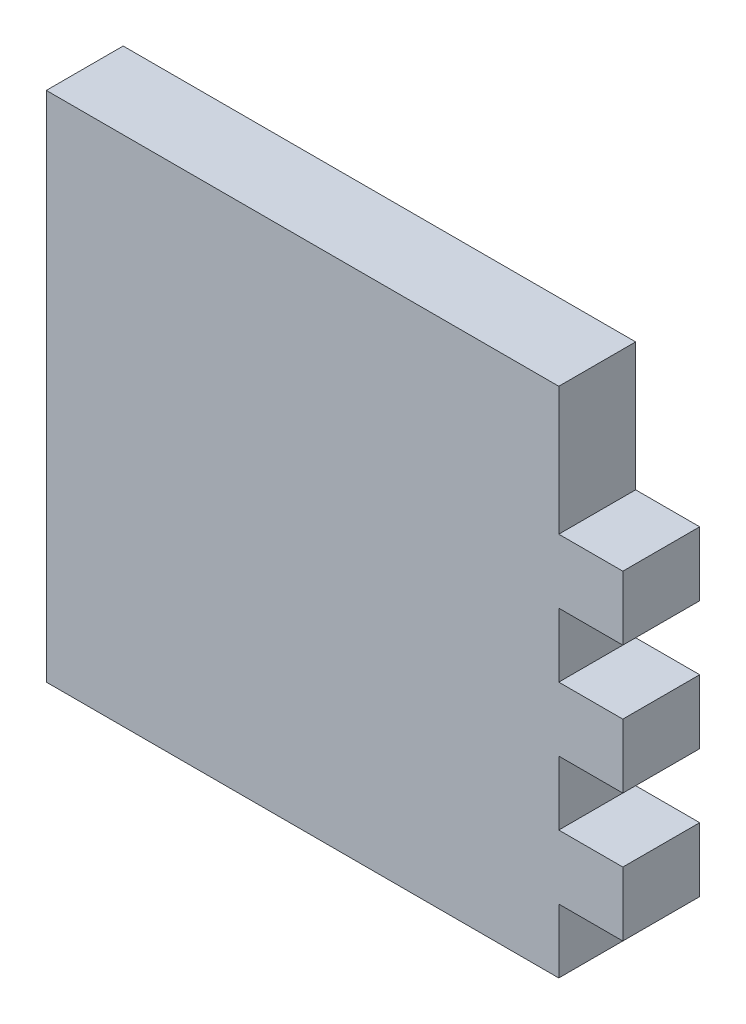
ISO-10303-21;
HEADER;
FILE_DESCRIPTION(('STEP AP214'),'2;1');
FILE_NAME('part.step','',(''),(''),'','','');
FILE_SCHEMA(('AUTOMOTIVE_DESIGN { 1 0 10303 214 1 1 1 1 }'));
ENDSEC;
DATA;
#1=APPLICATION_CONTEXT('core data for automotive mechanical design processes');
#2=APPLICATION_PROTOCOL_DEFINITION('international standard','automotive_design',2000,#1);
#3=PRODUCT_CONTEXT('',#1,'mechanical');
#4=PRODUCT('Part','Part','',(#3));
#5=PRODUCT_RELATED_PRODUCT_CATEGORY('part','',(#4));
#6=PRODUCT_DEFINITION_FORMATION('','',#4);
#7=PRODUCT_DEFINITION_CONTEXT('part definition',#1,'design');
#8=PRODUCT_DEFINITION('design','',#6,#7);
#9=PRODUCT_DEFINITION_SHAPE('','',#8);
#10=(LENGTH_UNIT() NAMED_UNIT(*) SI_UNIT(.MILLI.,.METRE.));
#11=(NAMED_UNIT(*) PLANE_ANGLE_UNIT() SI_UNIT($,.RADIAN.));
#12=(NAMED_UNIT(*) SI_UNIT($,.STERADIAN.) SOLID_ANGLE_UNIT());
#13=UNCERTAINTY_MEASURE_WITH_UNIT(LENGTH_MEASURE(1.E-05),#10,'distance_accuracy_value','');
#14=(GEOMETRIC_REPRESENTATION_CONTEXT(3) GLOBAL_UNCERTAINTY_ASSIGNED_CONTEXT((#13)) GLOBAL_UNIT_ASSIGNED_CONTEXT((#10,
#11,#12)) REPRESENTATION_CONTEXT('',''));
#15=CARTESIAN_POINT('',(0.,0.,0.));
#16=DIRECTION('',(0.,0.,1.));
#17=DIRECTION('',(1.,0.,0.));
#18=AXIS2_PLACEMENT_3D('',#15,#16,#17);
#19=CARTESIAN_POINT('',(27.3134328358209,0.,6.));
#20=DIRECTION('',(1.,0.,0.));
#21=DIRECTION('',(0.,0.,-1.));
#22=AXIS2_PLACEMENT_3D('',#19,#20,#21);
#23=PLANE('',#22);
#24=DIRECTION('',(0.,-1.,0.));
#25=VECTOR('',#24,1.);
#26=CARTESIAN_POINT('',(27.3134328358209,0.,0.));
#27=LINE('',#26,#25);
#28=CARTESIAN_POINT('',(27.3134328358209,-20.5970149253731,0.));
#29=VERTEX_POINT('',#28);
#30=CARTESIAN_POINT('',(27.3134328358209,-25.5970149253731,0.));
#31=VERTEX_POINT('',#30);
#32=EDGE_CURVE('E257',#29,#31,#27,.T.);
#33=ORIENTED_EDGE('',*,*,#32,.F.);
#34=DIRECTION('',(0.,0.,-1.));
#35=VECTOR('',#34,1.);
#36=CARTESIAN_POINT('',(27.3134328358209,-20.5970149253731,6.));
#37=LINE('',#36,#35);
#38=CARTESIAN_POINT('',(27.3134328358209,-20.5970149253731,6.));
#39=VERTEX_POINT('',#38);
#40=EDGE_CURVE('E354',#39,#29,#37,.T.);
#41=ORIENTED_EDGE('',*,*,#40,.F.);
#42=DIRECTION('',(0.,-1.,0.));
#43=VECTOR('',#42,1.);
#44=CARTESIAN_POINT('',(27.3134328358209,0.,6.));
#45=LINE('',#44,#43);
#46=CARTESIAN_POINT('',(27.3134328358209,-25.5970149253731,6.));
#47=VERTEX_POINT('',#46);
#48=EDGE_CURVE('E172',#39,#47,#45,.T.);
#49=ORIENTED_EDGE('',*,*,#48,.T.);
#50=DIRECTION('',(0.,0.,-1.));
#51=VECTOR('',#50,1.);
#52=CARTESIAN_POINT('',(27.3134328358209,-25.5970149253731,6.));
#53=LINE('',#52,#51);
#54=EDGE_CURVE('E273',#47,#31,#53,.T.);
#55=ORIENTED_EDGE('',*,*,#54,.T.);
#56=EDGE_LOOP('',(#33,#41,#49,#55));
#57=FACE_BOUND('',#56,.T.);
#58=ADVANCED_FACE('F41',(#57),#23,.T.);
#59=DIRECTION('',(0.,0.,-1.));
#60=VECTOR('',#59,1.);
#61=CARTESIAN_POINT('',(27.3134328358209,-15.5970149253731,6.));
#62=LINE('',#61,#60);
#63=CARTESIAN_POINT('',(27.3134328358209,-15.5970149253731,6.));
#64=VERTEX_POINT('',#63);
#65=CARTESIAN_POINT('',(27.3134328358209,-15.5970149253731,0.));
#66=VERTEX_POINT('',#65);
#67=EDGE_CURVE('E185',#64,#66,#62,.T.);
#68=ORIENTED_EDGE('',*,*,#67,.T.);
#69=CARTESIAN_POINT('',(27.3134328358209,-10.5970149253731,0.));
#70=VERTEX_POINT('',#69);
#71=EDGE_CURVE('E329',#70,#66,#27,.T.);
#72=ORIENTED_EDGE('',*,*,#71,.F.);
#73=DIRECTION('',(0.,0.,-1.));
#74=VECTOR('',#73,1.);
#75=CARTESIAN_POINT('',(27.3134328358209,-10.5970149253731,6.));
#76=LINE('',#75,#74);
#77=CARTESIAN_POINT('',(27.3134328358209,-10.5970149253731,6.));
#78=VERTEX_POINT('',#77);
#79=EDGE_CURVE('E200',#78,#70,#76,.T.);
#80=ORIENTED_EDGE('',*,*,#79,.F.);
#81=EDGE_CURVE('E342',#78,#64,#45,.T.);
#82=ORIENTED_EDGE('',*,*,#81,.T.);
#83=EDGE_LOOP('',(#68,#72,#80,#82));
#84=FACE_BOUND('',#83,.T.);
#85=ADVANCED_FACE('F350',(#84),#23,.T.);
#86=CARTESIAN_POINT('',(27.3134328358209,14.4029850746269,6.));
#87=VERTEX_POINT('',#86);
#88=CARTESIAN_POINT('',(27.3134328358209,4.40298507462687,6.));
#89=VERTEX_POINT('',#88);
#90=EDGE_CURVE('E258',#87,#89,#45,.T.);
#91=ORIENTED_EDGE('',*,*,#90,.T.);
#92=DIRECTION('',(0.,0.,-1.));
#93=VECTOR('',#92,1.);
#94=CARTESIAN_POINT('',(27.3134328358209,4.40298507462687,6.));
#95=LINE('',#94,#93);
#96=CARTESIAN_POINT('',(27.3134328358209,4.40298507462687,0.));
#97=VERTEX_POINT('',#96);
#98=EDGE_CURVE('E250',#89,#97,#95,.T.);
#99=ORIENTED_EDGE('',*,*,#98,.T.);
#100=CARTESIAN_POINT('',(27.3134328358209,14.4029850746269,0.));
#101=VERTEX_POINT('',#100);
#102=EDGE_CURVE('E274',#101,#97,#27,.T.);
#103=ORIENTED_EDGE('',*,*,#102,.F.);
#104=DIRECTION('',(0.,0.,-1.));
#105=VECTOR('',#104,1.);
#106=CARTESIAN_POINT('',(27.3134328358209,14.4029850746269,6.));
#107=LINE('',#106,#105);
#108=EDGE_CURVE('E11',#87,#101,#107,.T.);
#109=ORIENTED_EDGE('',*,*,#108,.F.);
#110=EDGE_LOOP('',(#91,#99,#103,#109));
#111=FACE_BOUND('',#110,.T.);
#112=ADVANCED_FACE('F310',(#111),#23,.T.);
#113=DIRECTION('',(0.,0.,-1.));
#114=VECTOR('',#113,1.);
#115=CARTESIAN_POINT('',(27.3134328358209,-5.59701492537314,6.));
#116=LINE('',#115,#114);
#117=CARTESIAN_POINT('',(27.3134328358209,-5.59701492537314,6.));
#118=VERTEX_POINT('',#117);
#119=CARTESIAN_POINT('',(27.3134328358209,-5.59701492537314,0.));
#120=VERTEX_POINT('',#119);
#121=EDGE_CURVE('E210',#118,#120,#116,.T.);
#122=ORIENTED_EDGE('',*,*,#121,.T.);
#123=CARTESIAN_POINT('',(27.3134328358209,-0.597014925373136,0.));
#124=VERTEX_POINT('',#123);
#125=EDGE_CURVE('E279',#124,#120,#27,.T.);
#126=ORIENTED_EDGE('',*,*,#125,.F.);
#127=DIRECTION('',(0.,0.,-1.));
#128=VECTOR('',#127,1.);
#129=CARTESIAN_POINT('',(27.3134328358209,-0.597014925373136,6.));
#130=LINE('',#129,#128);
#131=CARTESIAN_POINT('',(27.3134328358209,-0.597014925373136,6.));
#132=VERTEX_POINT('',#131);
#133=EDGE_CURVE('E247',#132,#124,#130,.T.);
#134=ORIENTED_EDGE('',*,*,#133,.F.);
#135=EDGE_CURVE('E263',#132,#118,#45,.T.);
#136=ORIENTED_EDGE('',*,*,#135,.T.);
#137=EDGE_LOOP('',(#122,#126,#134,#136));
#138=FACE_BOUND('',#137,.T.);
#139=ADVANCED_FACE('F43',(#138),#23,.T.);
#140=CARTESIAN_POINT('',(0.,14.4029850746269,6.));
#141=DIRECTION('',(0.,1.,0.));
#142=DIRECTION('',(0.,0.,1.));
#143=AXIS2_PLACEMENT_3D('',#140,#141,#142);
#144=PLANE('',#143);
#145=DIRECTION('',(1.,0.,0.));
#146=VECTOR('',#145,1.);
#147=CARTESIAN_POINT('',(0.,14.4029850746269,0.));
#148=LINE('',#147,#146);
#149=CARTESIAN_POINT('',(-12.6865671641791,14.4029850746269,0.));
#150=VERTEX_POINT('',#149);
#151=EDGE_CURVE('E278',#150,#101,#148,.T.);
#152=ORIENTED_EDGE('',*,*,#151,.F.);
#153=DIRECTION('',(0.,0.,-1.));
#154=VECTOR('',#153,1.);
#155=CARTESIAN_POINT('',(-12.6865671641791,14.4029850746269,6.));
#156=LINE('',#155,#154);
#157=CARTESIAN_POINT('',(-12.6865671641791,14.4029850746269,6.));
#158=VERTEX_POINT('',#157);
#159=EDGE_CURVE('E50',#158,#150,#156,.T.);
#160=ORIENTED_EDGE('',*,*,#159,.F.);
#161=DIRECTION('',(1.,0.,0.));
#162=VECTOR('',#161,1.);
#163=CARTESIAN_POINT('',(0.,14.4029850746269,6.));
#164=LINE('',#163,#162);
#165=EDGE_CURVE('E262',#158,#87,#164,.T.);
#166=ORIENTED_EDGE('',*,*,#165,.T.);
#167=ORIENTED_EDGE('',*,*,#108,.T.);
#168=EDGE_LOOP('',(#152,#160,#166,#167));
#169=FACE_BOUND('',#168,.T.);
#170=ADVANCED_FACE('F307',(#169),#144,.T.);
#171=CARTESIAN_POINT('',(-12.6865671641791,0.,6.));
#172=DIRECTION('',(1.,0.,0.));
#173=DIRECTION('',(0.,1.,0.));
#174=AXIS2_PLACEMENT_3D('',#171,#172,#173);
#175=PLANE('',#174);
#176=DIRECTION('',(0.,-1.,0.));
#177=VECTOR('',#176,1.);
#178=CARTESIAN_POINT('',(-12.6865671641791,0.,0.));
#179=LINE('',#178,#177);
#180=CARTESIAN_POINT('',(-12.6865671641791,-25.5970149253731,0.));
#181=VERTEX_POINT('',#180);
#182=EDGE_CURVE('E283',#150,#181,#179,.T.);
#183=ORIENTED_EDGE('',*,*,#182,.T.);
#184=DIRECTION('',(0.,0.,-1.));
#185=VECTOR('',#184,1.);
#186=CARTESIAN_POINT('',(-12.6865671641791,-25.5970149253731,6.));
#187=LINE('',#186,#185);
#188=CARTESIAN_POINT('',(-12.6865671641791,-25.5970149253731,6.));
#189=VERTEX_POINT('',#188);
#190=EDGE_CURVE('E293',#189,#181,#187,.T.);
#191=ORIENTED_EDGE('',*,*,#190,.F.);
#192=DIRECTION('',(0.,-1.,0.));
#193=VECTOR('',#192,1.);
#194=CARTESIAN_POINT('',(-12.6865671641791,0.,6.));
#195=LINE('',#194,#193);
#196=EDGE_CURVE('E267',#158,#189,#195,.T.);
#197=ORIENTED_EDGE('',*,*,#196,.F.);
#198=ORIENTED_EDGE('',*,*,#159,.T.);
#199=EDGE_LOOP('',(#183,#191,#197,#198));
#200=FACE_BOUND('',#199,.T.);
#201=ADVANCED_FACE('F300',(#200),#175,.F.);
#202=CARTESIAN_POINT('',(0.,-25.5970149253731,6.));
#203=DIRECTION('',(0.,1.,0.));
#204=DIRECTION('',(0.,0.,1.));
#205=AXIS2_PLACEMENT_3D('',#202,#203,#204);
#206=PLANE('',#205);
#207=DIRECTION('',(1.,0.,0.));
#208=VECTOR('',#207,1.);
#209=CARTESIAN_POINT('',(0.,-25.5970149253731,0.));
#210=LINE('',#209,#208);
#211=EDGE_CURVE('E286',#181,#31,#210,.T.);
#212=ORIENTED_EDGE('',*,*,#211,.T.);
#213=ORIENTED_EDGE('',*,*,#54,.F.);
#214=DIRECTION('',(1.,0.,0.));
#215=VECTOR('',#214,1.);
#216=CARTESIAN_POINT('',(0.,-25.5970149253731,6.));
#217=LINE('',#216,#215);
#218=EDGE_CURVE('E270',#189,#47,#217,.T.);
#219=ORIENTED_EDGE('',*,*,#218,.F.);
#220=ORIENTED_EDGE('',*,*,#190,.T.);
#221=EDGE_LOOP('',(#212,#213,#219,#220));
#222=FACE_BOUND('',#221,.T.);
#223=ADVANCED_FACE('F339',(#222),#206,.F.);
#224=CARTESIAN_POINT('',(0.,0.,6.));
#225=DIRECTION('',(0.,0.,1.));
#226=DIRECTION('',(1.,0.,0.));
#227=AXIS2_PLACEMENT_3D('',#224,#225,#226);
#228=PLANE('',#227);
#229=ORIENTED_EDGE('',*,*,#90,.F.);
#230=ORIENTED_EDGE('',*,*,#165,.F.);
#231=ORIENTED_EDGE('',*,*,#196,.T.);
#232=ORIENTED_EDGE('',*,*,#218,.T.);
#233=ORIENTED_EDGE('',*,*,#48,.F.);
#234=DIRECTION('',(1.,0.,0.));
#235=VECTOR('',#234,1.);
#236=CARTESIAN_POINT('',(0.,-20.5970149253731,6.));
#237=LINE('',#236,#235);
#238=CARTESIAN_POINT('',(32.3134328358209,-20.5970149253731,6.));
#239=VERTEX_POINT('',#238);
#240=EDGE_CURVE('E166',#39,#239,#237,.T.);
#241=ORIENTED_EDGE('',*,*,#240,.T.);
#242=DIRECTION('',(0.,1.,0.));
#243=VECTOR('',#242,1.);
#244=CARTESIAN_POINT('',(32.3134328358209,0.,6.));
#245=LINE('',#244,#243);
#246=CARTESIAN_POINT('',(32.3134328358209,-15.5970149253731,6.));
#247=VERTEX_POINT('',#246);
#248=EDGE_CURVE('E154',#239,#247,#245,.T.);
#249=ORIENTED_EDGE('',*,*,#248,.T.);
#250=DIRECTION('',(1.,0.,0.));
#251=VECTOR('',#250,1.);
#252=CARTESIAN_POINT('',(0.,-15.5970149253731,6.));
#253=LINE('',#252,#251);
#254=EDGE_CURVE('E165',#64,#247,#253,.T.);
#255=ORIENTED_EDGE('',*,*,#254,.F.);
#256=ORIENTED_EDGE('',*,*,#81,.F.);
#257=DIRECTION('',(1.,0.,0.));
#258=VECTOR('',#257,1.);
#259=CARTESIAN_POINT('',(0.,-10.5970149253731,6.));
#260=LINE('',#259,#258);
#261=CARTESIAN_POINT('',(32.3134328358209,-10.5970149253731,6.));
#262=VERTEX_POINT('',#261);
#263=EDGE_CURVE('E189',#78,#262,#260,.T.);
#264=ORIENTED_EDGE('',*,*,#263,.T.);
#265=DIRECTION('',(0.,1.,0.));
#266=VECTOR('',#265,1.);
#267=CARTESIAN_POINT('',(32.3134328358209,0.,6.));
#268=LINE('',#267,#266);
#269=CARTESIAN_POINT('',(32.3134328358209,-5.59701492537314,6.));
#270=VERTEX_POINT('',#269);
#271=EDGE_CURVE('E193',#262,#270,#268,.T.);
#272=ORIENTED_EDGE('',*,*,#271,.T.);
#273=DIRECTION('',(1.,0.,0.));
#274=VECTOR('',#273,1.);
#275=CARTESIAN_POINT('',(0.,-5.59701492537314,6.));
#276=LINE('',#275,#274);
#277=EDGE_CURVE('E197',#118,#270,#276,.T.);
#278=ORIENTED_EDGE('',*,*,#277,.F.);
#279=ORIENTED_EDGE('',*,*,#135,.F.);
#280=DIRECTION('',(1.,0.,0.));
#281=VECTOR('',#280,1.);
#282=CARTESIAN_POINT('',(0.,-0.597014925373136,6.));
#283=LINE('',#282,#281);
#284=CARTESIAN_POINT('',(32.3134328358209,-0.597014925373136,6.));
#285=VERTEX_POINT('',#284);
#286=EDGE_CURVE('E231',#132,#285,#283,.T.);
#287=ORIENTED_EDGE('',*,*,#286,.T.);
#288=DIRECTION('',(0.,-1.,0.));
#289=VECTOR('',#288,1.);
#290=CARTESIAN_POINT('',(32.3134328358209,0.,6.));
#291=LINE('',#290,#289);
#292=CARTESIAN_POINT('',(32.3134328358209,4.40298507462686,6.));
#293=VERTEX_POINT('',#292);
#294=EDGE_CURVE('E222',#293,#285,#291,.T.);
#295=ORIENTED_EDGE('',*,*,#294,.F.);
#296=DIRECTION('',(1.,0.,0.));
#297=VECTOR('',#296,1.);
#298=CARTESIAN_POINT('',(0.,4.40298507462687,6.));
#299=LINE('',#298,#297);
#300=EDGE_CURVE('E226',#89,#293,#299,.T.);
#301=ORIENTED_EDGE('',*,*,#300,.F.);
#302=EDGE_LOOP('',(#229,#230,#231,#232,#233,#241,#249,#255,#256,#264,#272,#278,#279,#287,#295,#301));
#303=FACE_BOUND('',#302,.T.);
#304=ADVANCED_FACE('F170',(#303),#228,.T.);
#305=CARTESIAN_POINT('',(0.,0.,0.));
#306=DIRECTION('',(0.,0.,1.));
#307=DIRECTION('',(1.,0.,0.));
#308=AXIS2_PLACEMENT_3D('',#305,#306,#307);
#309=PLANE('',#308);
#310=ORIENTED_EDGE('',*,*,#102,.T.);
#311=DIRECTION('',(1.,0.,0.));
#312=VECTOR('',#311,1.);
#313=CARTESIAN_POINT('',(0.,4.40298507462687,0.));
#314=LINE('',#313,#312);
#315=CARTESIAN_POINT('',(32.3134328358209,4.40298507462686,0.));
#316=VERTEX_POINT('',#315);
#317=EDGE_CURVE('E238',#97,#316,#314,.T.);
#318=ORIENTED_EDGE('',*,*,#317,.T.);
#319=DIRECTION('',(0.,-1.,0.));
#320=VECTOR('',#319,1.);
#321=CARTESIAN_POINT('',(32.3134328358209,0.,0.));
#322=LINE('',#321,#320);
#323=CARTESIAN_POINT('',(32.3134328358209,-0.597014925373136,0.));
#324=VERTEX_POINT('',#323);
#325=EDGE_CURVE('E221',#316,#324,#322,.T.);
#326=ORIENTED_EDGE('',*,*,#325,.T.);
#327=DIRECTION('',(1.,0.,0.));
#328=VECTOR('',#327,1.);
#329=CARTESIAN_POINT('',(0.,-0.597014925373136,0.));
#330=LINE('',#329,#328);
#331=EDGE_CURVE('E227',#124,#324,#330,.T.);
#332=ORIENTED_EDGE('',*,*,#331,.F.);
#333=ORIENTED_EDGE('',*,*,#125,.T.);
#334=DIRECTION('',(1.,0.,0.));
#335=VECTOR('',#334,1.);
#336=CARTESIAN_POINT('',(0.,-5.59701492537314,0.));
#337=LINE('',#336,#335);
#338=CARTESIAN_POINT('',(32.3134328358209,-5.59701492537314,0.));
#339=VERTEX_POINT('',#338);
#340=EDGE_CURVE('E194',#120,#339,#337,.T.);
#341=ORIENTED_EDGE('',*,*,#340,.T.);
#342=DIRECTION('',(0.,1.,0.));
#343=VECTOR('',#342,1.);
#344=CARTESIAN_POINT('',(32.3134328358209,0.,0.));
#345=LINE('',#344,#343);
#346=CARTESIAN_POINT('',(32.3134328358209,-10.5970149253731,0.));
#347=VERTEX_POINT('',#346);
#348=EDGE_CURVE('E183',#347,#339,#345,.T.);
#349=ORIENTED_EDGE('',*,*,#348,.F.);
#350=DIRECTION('',(1.,0.,0.));
#351=VECTOR('',#350,1.);
#352=CARTESIAN_POINT('',(0.,-10.5970149253731,0.));
#353=LINE('',#352,#351);
#354=EDGE_CURVE('E64',#70,#347,#353,.T.);
#355=ORIENTED_EDGE('',*,*,#354,.F.);
#356=ORIENTED_EDGE('',*,*,#71,.T.);
#357=DIRECTION('',(1.,0.,0.));
#358=VECTOR('',#357,1.);
#359=CARTESIAN_POINT('',(0.,-15.5970149253731,0.));
#360=LINE('',#359,#358);
#361=CARTESIAN_POINT('',(32.3134328358209,-15.5970149253731,0.));
#362=VERTEX_POINT('',#361);
#363=EDGE_CURVE('E176',#66,#362,#360,.T.);
#364=ORIENTED_EDGE('',*,*,#363,.T.);
#365=DIRECTION('',(0.,1.,0.));
#366=VECTOR('',#365,1.);
#367=CARTESIAN_POINT('',(32.3134328358209,0.,0.));
#368=LINE('',#367,#366);
#369=CARTESIAN_POINT('',(32.3134328358209,-20.5970149253731,0.));
#370=VERTEX_POINT('',#369);
#371=EDGE_CURVE('E361',#370,#362,#368,.T.);
#372=ORIENTED_EDGE('',*,*,#371,.F.);
#373=DIRECTION('',(1.,0.,0.));
#374=VECTOR('',#373,1.);
#375=CARTESIAN_POINT('',(0.,-20.5970149253731,0.));
#376=LINE('',#375,#374);
#377=EDGE_CURVE('E57',#29,#370,#376,.T.);
#378=ORIENTED_EDGE('',*,*,#377,.F.);
#379=ORIENTED_EDGE('',*,*,#32,.T.);
#380=ORIENTED_EDGE('',*,*,#211,.F.);
#381=ORIENTED_EDGE('',*,*,#182,.F.);
#382=ORIENTED_EDGE('',*,*,#151,.T.);
#383=EDGE_LOOP('',(#310,#318,#326,#332,#333,#341,#349,#355,#356,#364,#372,#378,#379,#380,#381,#382));
#384=FACE_BOUND('',#383,.T.);
#385=ADVANCED_FACE('F306',(#384),#309,.F.);
#386=CARTESIAN_POINT('',(32.3134328358209,0.,6.));
#387=DIRECTION('',(1.,0.,0.));
#388=DIRECTION('',(0.,0.,-1.));
#389=AXIS2_PLACEMENT_3D('',#386,#387,#388);
#390=PLANE('',#389);
#391=ORIENTED_EDGE('',*,*,#325,.F.);
#392=DIRECTION('',(0.,0.,-1.));
#393=VECTOR('',#392,1.);
#394=CARTESIAN_POINT('',(32.3134328358209,4.40298507462686,6.));
#395=LINE('',#394,#393);
#396=EDGE_CURVE('E254',#293,#316,#395,.T.);
#397=ORIENTED_EDGE('',*,*,#396,.F.);
#398=ORIENTED_EDGE('',*,*,#294,.T.);
#399=DIRECTION('',(0.,0.,-1.));
#400=VECTOR('',#399,1.);
#401=CARTESIAN_POINT('',(32.3134328358209,-0.597014925373136,6.));
#402=LINE('',#401,#400);
#403=EDGE_CURVE('E234',#285,#324,#402,.T.);
#404=ORIENTED_EDGE('',*,*,#403,.T.);
#405=EDGE_LOOP('',(#391,#397,#398,#404));
#406=FACE_BOUND('',#405,.T.);
#407=ADVANCED_FACE('F318',(#406),#390,.T.);
#408=CARTESIAN_POINT('',(0.,4.40298507462687,6.));
#409=DIRECTION('',(0.,1.,0.));
#410=DIRECTION('',(-1.,0.,0.));
#411=AXIS2_PLACEMENT_3D('',#408,#409,#410);
#412=PLANE('',#411);
#413=ORIENTED_EDGE('',*,*,#317,.F.);
#414=ORIENTED_EDGE('',*,*,#98,.F.);
#415=ORIENTED_EDGE('',*,*,#300,.T.);
#416=ORIENTED_EDGE('',*,*,#396,.T.);
#417=EDGE_LOOP('',(#413,#414,#415,#416));
#418=FACE_BOUND('',#417,.T.);
#419=ADVANCED_FACE('F314',(#418),#412,.T.);
#420=CARTESIAN_POINT('',(0.,-0.597014925373136,6.));
#421=DIRECTION('',(0.,1.,0.));
#422=DIRECTION('',(0.,0.,1.));
#423=AXIS2_PLACEMENT_3D('',#420,#421,#422);
#424=PLANE('',#423);
#425=ORIENTED_EDGE('',*,*,#331,.T.);
#426=ORIENTED_EDGE('',*,*,#403,.F.);
#427=ORIENTED_EDGE('',*,*,#286,.F.);
#428=ORIENTED_EDGE('',*,*,#133,.T.);
#429=EDGE_LOOP('',(#425,#426,#427,#428));
#430=FACE_BOUND('',#429,.T.);
#431=ADVANCED_FACE('F321',(#430),#424,.F.);
#432=CARTESIAN_POINT('',(0.,-10.5970149253731,6.));
#433=DIRECTION('',(0.,1.,0.));
#434=DIRECTION('',(0.,0.,1.));
#435=AXIS2_PLACEMENT_3D('',#432,#433,#434);
#436=PLANE('',#435);
#437=ORIENTED_EDGE('',*,*,#354,.T.);
#438=DIRECTION('',(0.,0.,-1.));
#439=VECTOR('',#438,1.);
#440=CARTESIAN_POINT('',(32.3134328358209,-10.5970149253731,6.));
#441=LINE('',#440,#439);
#442=EDGE_CURVE('E217',#262,#347,#441,.T.);
#443=ORIENTED_EDGE('',*,*,#442,.F.);
#444=ORIENTED_EDGE('',*,*,#263,.F.);
#445=ORIENTED_EDGE('',*,*,#79,.T.);
#446=EDGE_LOOP('',(#437,#443,#444,#445));
#447=FACE_BOUND('',#446,.T.);
#448=ADVANCED_FACE('F471',(#447),#436,.F.);
#449=CARTESIAN_POINT('',(32.3134328358209,0.,6.));
#450=DIRECTION('',(-1.,0.,0.));
#451=DIRECTION('',(0.,0.,1.));
#452=AXIS2_PLACEMENT_3D('',#449,#450,#451);
#453=PLANE('',#452);
#454=ORIENTED_EDGE('',*,*,#348,.T.);
#455=DIRECTION('',(0.,0.,-1.));
#456=VECTOR('',#455,1.);
#457=CARTESIAN_POINT('',(32.3134328358209,-5.59701492537314,6.));
#458=LINE('',#457,#456);
#459=EDGE_CURVE('E214',#270,#339,#458,.T.);
#460=ORIENTED_EDGE('',*,*,#459,.F.);
#461=ORIENTED_EDGE('',*,*,#271,.F.);
#462=ORIENTED_EDGE('',*,*,#442,.T.);
#463=EDGE_LOOP('',(#454,#460,#461,#462));
#464=FACE_BOUND('',#463,.T.);
#465=ADVANCED_FACE('F480',(#464),#453,.F.);
#466=CARTESIAN_POINT('',(0.,-5.59701492537314,6.));
#467=DIRECTION('',(0.,1.,0.));
#468=DIRECTION('',(0.,0.,1.));
#469=AXIS2_PLACEMENT_3D('',#466,#467,#468);
#470=PLANE('',#469);
#471=ORIENTED_EDGE('',*,*,#340,.F.);
#472=ORIENTED_EDGE('',*,*,#121,.F.);
#473=ORIENTED_EDGE('',*,*,#277,.T.);
#474=ORIENTED_EDGE('',*,*,#459,.T.);
#475=EDGE_LOOP('',(#471,#472,#473,#474));
#476=FACE_BOUND('',#475,.T.);
#477=ADVANCED_FACE('F490',(#476),#470,.T.);
#478=CARTESIAN_POINT('',(0.,-20.5970149253731,6.));
#479=DIRECTION('',(0.,1.,0.));
#480=DIRECTION('',(0.,0.,1.));
#481=AXIS2_PLACEMENT_3D('',#478,#479,#480);
#482=PLANE('',#481);
#483=ORIENTED_EDGE('',*,*,#377,.T.);
#484=DIRECTION('',(0.,0.,-1.));
#485=VECTOR('',#484,1.);
#486=CARTESIAN_POINT('',(32.3134328358209,-20.5970149253731,6.));
#487=LINE('',#486,#485);
#488=EDGE_CURVE('E159',#239,#370,#487,.T.);
#489=ORIENTED_EDGE('',*,*,#488,.F.);
#490=ORIENTED_EDGE('',*,*,#240,.F.);
#491=ORIENTED_EDGE('',*,*,#40,.T.);
#492=EDGE_LOOP('',(#483,#489,#490,#491));
#493=FACE_BOUND('',#492,.T.);
#494=ADVANCED_FACE('F178',(#493),#482,.F.);
#495=CARTESIAN_POINT('',(32.3134328358209,0.,6.));
#496=DIRECTION('',(-1.,0.,0.));
#497=DIRECTION('',(0.,0.,1.));
#498=AXIS2_PLACEMENT_3D('',#495,#496,#497);
#499=PLANE('',#498);
#500=ORIENTED_EDGE('',*,*,#371,.T.);
#501=DIRECTION('',(0.,0.,-1.));
#502=VECTOR('',#501,1.);
#503=CARTESIAN_POINT('',(32.3134328358209,-15.5970149253731,6.));
#504=LINE('',#503,#502);
#505=EDGE_CURVE('E160',#247,#362,#504,.T.);
#506=ORIENTED_EDGE('',*,*,#505,.F.);
#507=ORIENTED_EDGE('',*,*,#248,.F.);
#508=ORIENTED_EDGE('',*,*,#488,.T.);
#509=EDGE_LOOP('',(#500,#506,#507,#508));
#510=FACE_BOUND('',#509,.T.);
#511=ADVANCED_FACE('F157',(#510),#499,.F.);
#512=CARTESIAN_POINT('',(0.,-15.5970149253731,6.));
#513=DIRECTION('',(0.,1.,0.));
#514=DIRECTION('',(-1.,0.,0.));
#515=AXIS2_PLACEMENT_3D('',#512,#513,#514);
#516=PLANE('',#515);
#517=ORIENTED_EDGE('',*,*,#363,.F.);
#518=ORIENTED_EDGE('',*,*,#67,.F.);
#519=ORIENTED_EDGE('',*,*,#254,.T.);
#520=ORIENTED_EDGE('',*,*,#505,.T.);
#521=EDGE_LOOP('',(#517,#518,#519,#520));
#522=FACE_BOUND('',#521,.T.);
#523=ADVANCED_FACE('F366',(#522),#516,.T.);
#524=CLOSED_SHELL('',(#58,#85,#112,#139,#170,#201,#223,#304,#385,#407,#419,#431,#448,#465,#477,
#494,#511,#523));
#525=MANIFOLD_SOLID_BREP('B2',#524);
#526=ADVANCED_BREP_SHAPE_REPRESENTATION('',(#18,#525),#14);
#527=SHAPE_DEFINITION_REPRESENTATION(#9,#526);
ENDSEC;
END-ISO-10303-21;
